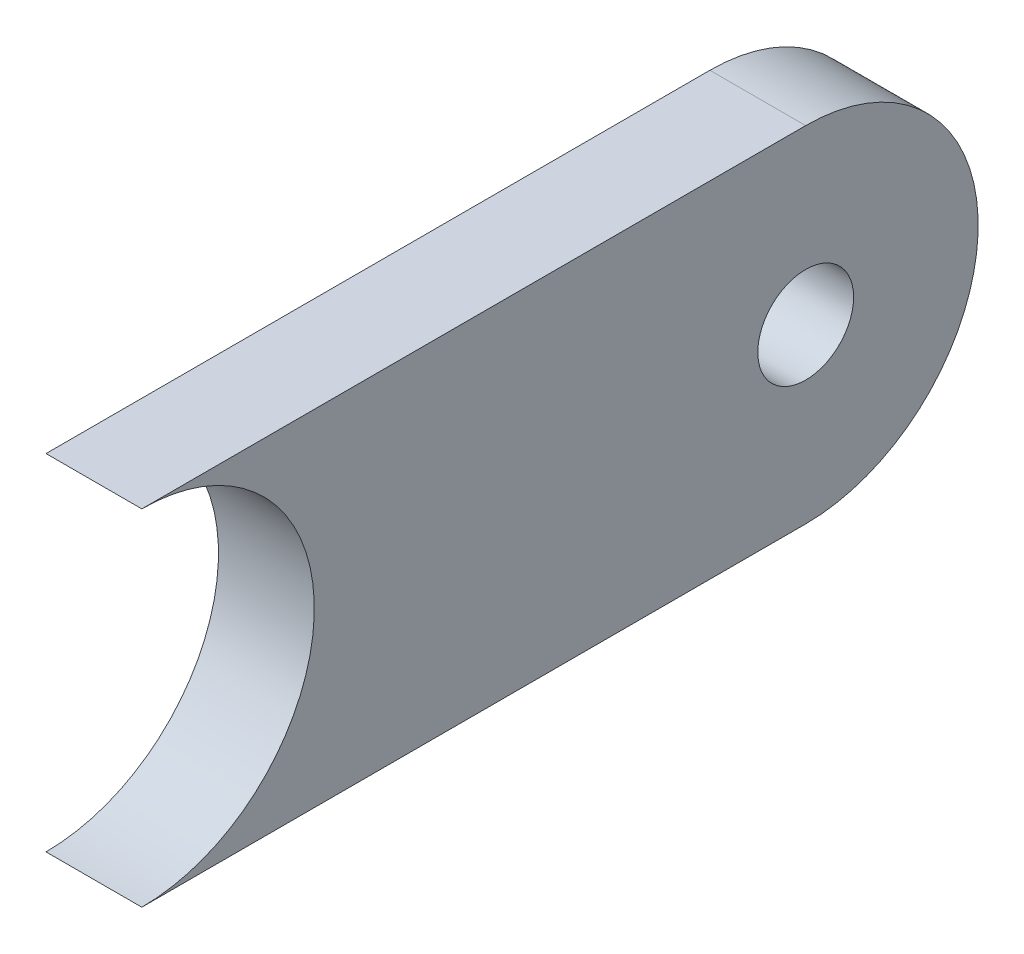
ISO-10303-21;
HEADER;
FILE_DESCRIPTION(('STEP AP214'),'2;1');
FILE_NAME('part.step','',(''),(''),'','','');
FILE_SCHEMA(('AUTOMOTIVE_DESIGN { 1 0 10303 214 1 1 1 1 }'));
ENDSEC;
DATA;
#1=APPLICATION_CONTEXT('core data for automotive mechanical design processes');
#2=APPLICATION_PROTOCOL_DEFINITION('international standard','automotive_design',2000,#1);
#3=PRODUCT_CONTEXT('',#1,'mechanical');
#4=PRODUCT('Part','Part','',(#3));
#5=PRODUCT_RELATED_PRODUCT_CATEGORY('part','',(#4));
#6=PRODUCT_DEFINITION_FORMATION('','',#4);
#7=PRODUCT_DEFINITION_CONTEXT('part definition',#1,'design');
#8=PRODUCT_DEFINITION('design','',#6,#7);
#9=PRODUCT_DEFINITION_SHAPE('','',#8);
#10=(LENGTH_UNIT() NAMED_UNIT(*) SI_UNIT(.MILLI.,.METRE.));
#11=(NAMED_UNIT(*) PLANE_ANGLE_UNIT() SI_UNIT($,.RADIAN.));
#12=(NAMED_UNIT(*) SI_UNIT($,.STERADIAN.) SOLID_ANGLE_UNIT());
#13=UNCERTAINTY_MEASURE_WITH_UNIT(LENGTH_MEASURE(1.E-05),#10,'distance_accuracy_value','');
#14=(GEOMETRIC_REPRESENTATION_CONTEXT(3) GLOBAL_UNCERTAINTY_ASSIGNED_CONTEXT((#13)) GLOBAL_UNIT_ASSIGNED_CONTEXT((#10,
#11,#12)) REPRESENTATION_CONTEXT('',''));
#15=CARTESIAN_POINT('',(0.,0.,0.));
#16=DIRECTION('',(0.,0.,1.));
#17=DIRECTION('',(1.,0.,0.));
#18=AXIS2_PLACEMENT_3D('',#15,#16,#17);
#19=CARTESIAN_POINT('',(5.,0.,0.));
#20=DIRECTION('',(1.,0.,0.));
#21=DIRECTION('',(0.,0.,-1.));
#22=AXIS2_PLACEMENT_3D('',#19,#20,#21);
#23=PLANE('',#22);
#24=CARTESIAN_POINT('',(5.,0.,0.));
#25=DIRECTION('',(1.,0.,0.));
#26=DIRECTION('',(0.,0.,-1.));
#27=AXIS2_PLACEMENT_3D('',#24,#25,#26);
#28=CIRCLE('',#27,9.);
#29=CARTESIAN_POINT('',(5.,-9.,0.));
#30=VERTEX_POINT('',#29);
#31=CARTESIAN_POINT('',(5.,9.,0.));
#32=VERTEX_POINT('',#31);
#33=EDGE_CURVE('E92',#30,#32,#28,.T.);
#34=ORIENTED_EDGE('',*,*,#33,.T.);
#35=DIRECTION('',(0.,0.,1.));
#36=VECTOR('',#35,1.);
#37=CARTESIAN_POINT('',(5.,9.,34.64));
#38=LINE('',#37,#36);
#39=CARTESIAN_POINT('',(5.,9.,34.64));
#40=VERTEX_POINT('',#39);
#41=EDGE_CURVE('E87',#32,#40,#38,.T.);
#42=ORIENTED_EDGE('',*,*,#41,.T.);
#43=CARTESIAN_POINT('',(5.,0.,34.64));
#44=DIRECTION('',(-1.,0.,0.));
#45=DIRECTION('',(0.,0.,-1.));
#46=AXIS2_PLACEMENT_3D('',#43,#44,#45);
#47=CIRCLE('',#46,9.);
#48=CARTESIAN_POINT('',(5.,-9.,34.64));
#49=VERTEX_POINT('',#48);
#50=EDGE_CURVE('E90',#40,#49,#47,.T.);
#51=ORIENTED_EDGE('',*,*,#50,.T.);
#52=DIRECTION('',(0.,0.,-1.));
#53=VECTOR('',#52,1.);
#54=CARTESIAN_POINT('',(5.,-9.,0.));
#55=LINE('',#54,#53);
#56=EDGE_CURVE('E57',#49,#30,#55,.T.);
#57=ORIENTED_EDGE('',*,*,#56,.T.);
#58=EDGE_LOOP('',(#34,#42,#51,#57));
#59=FACE_BOUND('',#58,.T.);
#60=CARTESIAN_POINT('',(5.,0.,0.));
#61=DIRECTION('',(1.,0.,0.));
#62=DIRECTION('',(0.,0.,-1.));
#63=AXIS2_PLACEMENT_3D('',#60,#61,#62);
#64=CIRCLE('',#63,2.5);
#65=CARTESIAN_POINT('',(5.,0.,-2.5));
#66=VERTEX_POINT('',#65);
#67=EDGE_CURVE('E112',#66,#66,#64,.T.);
#68=ORIENTED_EDGE('',*,*,#67,.F.);
#69=EDGE_LOOP('',(#68));
#70=FACE_BOUND('',#69,.T.);
#71=ADVANCED_FACE('F39',(#59,#70),#23,.T.);
#72=CARTESIAN_POINT('',(0.,0.,0.));
#73=DIRECTION('',(1.,0.,0.));
#74=DIRECTION('',(0.,0.,-1.));
#75=AXIS2_PLACEMENT_3D('',#72,#73,#74);
#76=PLANE('',#75);
#77=CARTESIAN_POINT('',(0.,0.,0.));
#78=DIRECTION('',(1.,0.,0.));
#79=DIRECTION('',(0.,0.,-1.));
#80=AXIS2_PLACEMENT_3D('',#77,#78,#79);
#81=CIRCLE('',#80,9.);
#82=CARTESIAN_POINT('',(0.,-9.,0.));
#83=VERTEX_POINT('',#82);
#84=CARTESIAN_POINT('',(0.,9.,0.));
#85=VERTEX_POINT('',#84);
#86=EDGE_CURVE('E108',#83,#85,#81,.T.);
#87=ORIENTED_EDGE('',*,*,#86,.F.);
#88=DIRECTION('',(0.,0.,-1.));
#89=VECTOR('',#88,1.);
#90=CARTESIAN_POINT('',(0.,-9.,0.));
#91=LINE('',#90,#89);
#92=CARTESIAN_POINT('',(0.,-9.,34.64));
#93=VERTEX_POINT('',#92);
#94=EDGE_CURVE('E80',#93,#83,#91,.T.);
#95=ORIENTED_EDGE('',*,*,#94,.F.);
#96=CARTESIAN_POINT('',(0.,0.,34.64));
#97=DIRECTION('',(-1.,0.,0.));
#98=DIRECTION('',(0.,0.,-1.));
#99=AXIS2_PLACEMENT_3D('',#96,#97,#98);
#100=CIRCLE('',#99,9.);
#101=CARTESIAN_POINT('',(0.,9.,34.64));
#102=VERTEX_POINT('',#101);
#103=EDGE_CURVE('E74',#102,#93,#100,.T.);
#104=ORIENTED_EDGE('',*,*,#103,.F.);
#105=DIRECTION('',(0.,0.,1.));
#106=VECTOR('',#105,1.);
#107=CARTESIAN_POINT('',(0.,9.,34.64));
#108=LINE('',#107,#106);
#109=EDGE_CURVE('E97',#85,#102,#108,.T.);
#110=ORIENTED_EDGE('',*,*,#109,.F.);
#111=EDGE_LOOP('',(#87,#95,#104,#110));
#112=FACE_BOUND('',#111,.T.);
#113=CARTESIAN_POINT('',(0.,0.,0.));
#114=DIRECTION('',(1.,0.,0.));
#115=DIRECTION('',(0.,0.,-1.));
#116=AXIS2_PLACEMENT_3D('',#113,#114,#115);
#117=CIRCLE('',#116,2.5);
#118=CARTESIAN_POINT('',(0.,0.,-2.5));
#119=VERTEX_POINT('',#118);
#120=EDGE_CURVE('E130',#119,#119,#117,.T.);
#121=ORIENTED_EDGE('',*,*,#120,.T.);
#122=EDGE_LOOP('',(#121));
#123=FACE_BOUND('',#122,.T.);
#124=ADVANCED_FACE('F125',(#112,#123),#76,.F.);
#125=CARTESIAN_POINT('',(5.,0.,0.));
#126=DIRECTION('',(-1.,0.,0.));
#127=DIRECTION('',(0.,0.,1.));
#128=AXIS2_PLACEMENT_3D('',#125,#126,#127);
#129=CYLINDRICAL_SURFACE('',#128,9.);
#130=ORIENTED_EDGE('',*,*,#86,.T.);
#131=DIRECTION('',(-1.,0.,0.));
#132=VECTOR('',#131,1.);
#133=CARTESIAN_POINT('',(5.,9.,0.));
#134=LINE('',#133,#132);
#135=EDGE_CURVE('E11',#32,#85,#134,.T.);
#136=ORIENTED_EDGE('',*,*,#135,.F.);
#137=ORIENTED_EDGE('',*,*,#33,.F.);
#138=DIRECTION('',(-1.,0.,0.));
#139=VECTOR('',#138,1.);
#140=CARTESIAN_POINT('',(5.,-9.,0.));
#141=LINE('',#140,#139);
#142=EDGE_CURVE('E104',#30,#83,#141,.T.);
#143=ORIENTED_EDGE('',*,*,#142,.T.);
#144=EDGE_LOOP('',(#130,#136,#137,#143));
#145=FACE_BOUND('',#144,.T.);
#146=ADVANCED_FACE('F41',(#145),#129,.T.);
#147=CARTESIAN_POINT('',(5.,9.,34.64));
#148=DIRECTION('',(0.,-1.,0.));
#149=DIRECTION('',(0.,0.,-1.));
#150=AXIS2_PLACEMENT_3D('',#147,#148,#149);
#151=PLANE('',#150);
#152=ORIENTED_EDGE('',*,*,#109,.T.);
#153=DIRECTION('',(-1.,0.,0.));
#154=VECTOR('',#153,1.);
#155=CARTESIAN_POINT('',(5.,9.,34.64));
#156=LINE('',#155,#154);
#157=EDGE_CURVE('E49',#40,#102,#156,.T.);
#158=ORIENTED_EDGE('',*,*,#157,.F.);
#159=ORIENTED_EDGE('',*,*,#41,.F.);
#160=ORIENTED_EDGE('',*,*,#135,.T.);
#161=EDGE_LOOP('',(#152,#158,#159,#160));
#162=FACE_BOUND('',#161,.T.);
#163=ADVANCED_FACE('F96',(#162),#151,.F.);
#164=CARTESIAN_POINT('',(5.,0.,34.64));
#165=DIRECTION('',(-1.,0.,0.));
#166=DIRECTION('',(0.,0.,1.));
#167=AXIS2_PLACEMENT_3D('',#164,#165,#166);
#168=CYLINDRICAL_SURFACE('',#167,9.);
#169=ORIENTED_EDGE('',*,*,#103,.T.);
#170=DIRECTION('',(-1.,0.,0.));
#171=VECTOR('',#170,1.);
#172=CARTESIAN_POINT('',(5.,-9.,34.64));
#173=LINE('',#172,#171);
#174=EDGE_CURVE('E99',#49,#93,#173,.T.);
#175=ORIENTED_EDGE('',*,*,#174,.F.);
#176=ORIENTED_EDGE('',*,*,#50,.F.);
#177=ORIENTED_EDGE('',*,*,#157,.T.);
#178=EDGE_LOOP('',(#169,#175,#176,#177));
#179=FACE_BOUND('',#178,.T.);
#180=ADVANCED_FACE('F100',(#179),#168,.F.);
#181=CARTESIAN_POINT('',(5.,-9.,0.));
#182=DIRECTION('',(0.,1.,0.));
#183=DIRECTION('',(0.,0.,1.));
#184=AXIS2_PLACEMENT_3D('',#181,#182,#183);
#185=PLANE('',#184);
#186=ORIENTED_EDGE('',*,*,#94,.T.);
#187=ORIENTED_EDGE('',*,*,#142,.F.);
#188=ORIENTED_EDGE('',*,*,#56,.F.);
#189=ORIENTED_EDGE('',*,*,#174,.T.);
#190=EDGE_LOOP('',(#186,#187,#188,#189));
#191=FACE_BOUND('',#190,.T.);
#192=ADVANCED_FACE('F122',(#191),#185,.F.);
#193=CARTESIAN_POINT('',(5.,0.,0.));
#194=DIRECTION('',(-1.,0.,0.));
#195=DIRECTION('',(0.,0.,1.));
#196=AXIS2_PLACEMENT_3D('',#193,#194,#195);
#197=CYLINDRICAL_SURFACE('',#196,2.5);
#198=ORIENTED_EDGE('',*,*,#67,.T.);
#199=EDGE_LOOP('',(#198));
#200=FACE_BOUND('',#199,.T.);
#201=ORIENTED_EDGE('',*,*,#120,.F.);
#202=EDGE_LOOP('',(#201));
#203=FACE_BOUND('',#202,.T.);
#204=ADVANCED_FACE('F138',(#200,#203),#197,.F.);
#205=CLOSED_SHELL('',(#71,#124,#146,#163,#180,#192,#204));
#206=MANIFOLD_SOLID_BREP('B2',#205);
#207=ADVANCED_BREP_SHAPE_REPRESENTATION('',(#18,#206),#14);
#208=SHAPE_DEFINITION_REPRESENTATION(#9,#207);
ENDSEC;
END-ISO-10303-21;
